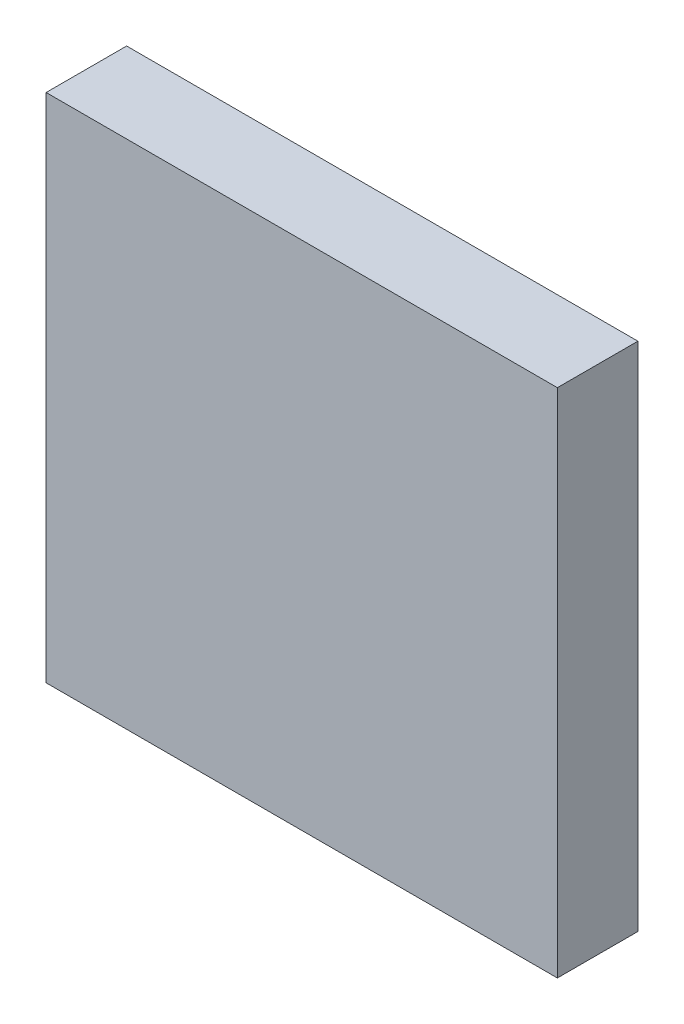
ISO-10303-21;
HEADER;
FILE_DESCRIPTION(('STEP AP214'),'2;1');
FILE_NAME('part.step','',(''),(''),'','','');
FILE_SCHEMA(('AUTOMOTIVE_DESIGN { 1 0 10303 214 1 1 1 1 }'));
ENDSEC;
DATA;
#1=APPLICATION_CONTEXT('core data for automotive mechanical design processes');
#2=APPLICATION_PROTOCOL_DEFINITION('international standard','automotive_design',2000,#1);
#3=PRODUCT_CONTEXT('',#1,'mechanical');
#4=PRODUCT('Part','Part','',(#3));
#5=PRODUCT_RELATED_PRODUCT_CATEGORY('part','',(#4));
#6=PRODUCT_DEFINITION_FORMATION('','',#4);
#7=PRODUCT_DEFINITION_CONTEXT('part definition',#1,'design');
#8=PRODUCT_DEFINITION('design','',#6,#7);
#9=PRODUCT_DEFINITION_SHAPE('','',#8);
#10=(LENGTH_UNIT() NAMED_UNIT(*) SI_UNIT(.MILLI.,.METRE.));
#11=(NAMED_UNIT(*) PLANE_ANGLE_UNIT() SI_UNIT($,.RADIAN.));
#12=(NAMED_UNIT(*) SI_UNIT($,.STERADIAN.) SOLID_ANGLE_UNIT());
#13=UNCERTAINTY_MEASURE_WITH_UNIT(LENGTH_MEASURE(1.E-05),#10,'distance_accuracy_value','');
#14=(GEOMETRIC_REPRESENTATION_CONTEXT(3) GLOBAL_UNCERTAINTY_ASSIGNED_CONTEXT((#13)) GLOBAL_UNIT_ASSIGNED_CONTEXT((#10,
#11,#12)) REPRESENTATION_CONTEXT('',''));
#15=CARTESIAN_POINT('',(0.,0.,0.));
#16=DIRECTION('',(0.,0.,1.));
#17=DIRECTION('',(1.,0.,0.));
#18=AXIS2_PLACEMENT_3D('',#15,#16,#17);
#19=CARTESIAN_POINT('',(31.75,31.75,10.));
#20=DIRECTION('',(0.,-1.,0.));
#21=DIRECTION('',(0.,0.,-1.));
#22=AXIS2_PLACEMENT_3D('',#19,#20,#21);
#23=PLANE('',#22);
#24=DIRECTION('',(-1.,0.,0.));
#25=VECTOR('',#24,1.);
#26=CARTESIAN_POINT('',(31.75,31.75,0.));
#27=LINE('',#26,#25);
#28=CARTESIAN_POINT('',(31.75,31.75,0.));
#29=VERTEX_POINT('',#28);
#30=CARTESIAN_POINT('',(-31.75,31.75,0.));
#31=VERTEX_POINT('',#30);
#32=EDGE_CURVE('E104',#29,#31,#27,.T.);
#33=ORIENTED_EDGE('',*,*,#32,.T.);
#34=DIRECTION('',(0.,0.,-1.));
#35=VECTOR('',#34,1.);
#36=CARTESIAN_POINT('',(-31.75,31.75,10.));
#37=LINE('',#36,#35);
#38=CARTESIAN_POINT('',(-31.75,31.75,10.));
#39=VERTEX_POINT('',#38);
#40=EDGE_CURVE('E11',#39,#31,#37,.T.);
#41=ORIENTED_EDGE('',*,*,#40,.F.);
#42=DIRECTION('',(-1.,0.,0.));
#43=VECTOR('',#42,1.);
#44=CARTESIAN_POINT('',(31.75,31.75,10.));
#45=LINE('',#44,#43);
#46=CARTESIAN_POINT('',(31.75,31.75,10.));
#47=VERTEX_POINT('',#46);
#48=EDGE_CURVE('E92',#47,#39,#45,.T.);
#49=ORIENTED_EDGE('',*,*,#48,.F.);
#50=DIRECTION('',(0.,0.,-1.));
#51=VECTOR('',#50,1.);
#52=CARTESIAN_POINT('',(31.75,31.75,10.));
#53=LINE('',#52,#51);
#54=EDGE_CURVE('E100',#47,#29,#53,.T.);
#55=ORIENTED_EDGE('',*,*,#54,.T.);
#56=EDGE_LOOP('',(#33,#41,#49,#55));
#57=FACE_BOUND('',#56,.T.);
#58=ADVANCED_FACE('F41',(#57),#23,.F.);
#59=CARTESIAN_POINT('',(-31.75,31.75,10.));
#60=DIRECTION('',(1.,0.,0.));
#61=DIRECTION('',(0.,0.,-1.));
#62=AXIS2_PLACEMENT_3D('',#59,#60,#61);
#63=PLANE('',#62);
#64=DIRECTION('',(0.,-1.,0.));
#65=VECTOR('',#64,1.);
#66=CARTESIAN_POINT('',(-31.75,31.75,0.));
#67=LINE('',#66,#65);
#68=CARTESIAN_POINT('',(-31.75,-31.75,0.));
#69=VERTEX_POINT('',#68);
#70=EDGE_CURVE('E96',#31,#69,#67,.T.);
#71=ORIENTED_EDGE('',*,*,#70,.T.);
#72=DIRECTION('',(0.,0.,-1.));
#73=VECTOR('',#72,1.);
#74=CARTESIAN_POINT('',(-31.75,-31.75,10.));
#75=LINE('',#74,#73);
#76=CARTESIAN_POINT('',(-31.75,-31.75,10.));
#77=VERTEX_POINT('',#76);
#78=EDGE_CURVE('E49',#77,#69,#75,.T.);
#79=ORIENTED_EDGE('',*,*,#78,.F.);
#80=DIRECTION('',(0.,-1.,0.));
#81=VECTOR('',#80,1.);
#82=CARTESIAN_POINT('',(-31.75,31.75,10.));
#83=LINE('',#82,#81);
#84=EDGE_CURVE('E87',#39,#77,#83,.T.);
#85=ORIENTED_EDGE('',*,*,#84,.F.);
#86=ORIENTED_EDGE('',*,*,#40,.T.);
#87=EDGE_LOOP('',(#71,#79,#85,#86));
#88=FACE_BOUND('',#87,.T.);
#89=ADVANCED_FACE('F95',(#88),#63,.F.);
#90=CARTESIAN_POINT('',(-31.75,-31.75,10.));
#91=DIRECTION('',(0.,1.,0.));
#92=DIRECTION('',(0.,0.,1.));
#93=AXIS2_PLACEMENT_3D('',#90,#91,#92);
#94=PLANE('',#93);
#95=DIRECTION('',(1.,0.,0.));
#96=VECTOR('',#95,1.);
#97=CARTESIAN_POINT('',(-31.75,-31.75,0.));
#98=LINE('',#97,#96);
#99=CARTESIAN_POINT('',(31.75,-31.75,0.));
#100=VERTEX_POINT('',#99);
#101=EDGE_CURVE('E74',#69,#100,#98,.T.);
#102=ORIENTED_EDGE('',*,*,#101,.T.);
#103=DIRECTION('',(0.,0.,-1.));
#104=VECTOR('',#103,1.);
#105=CARTESIAN_POINT('',(31.75,-31.75,10.));
#106=LINE('',#105,#104);
#107=CARTESIAN_POINT('',(31.75,-31.75,10.));
#108=VERTEX_POINT('',#107);
#109=EDGE_CURVE('E97',#108,#100,#106,.T.);
#110=ORIENTED_EDGE('',*,*,#109,.F.);
#111=DIRECTION('',(1.,0.,0.));
#112=VECTOR('',#111,1.);
#113=CARTESIAN_POINT('',(-31.75,-31.75,10.));
#114=LINE('',#113,#112);
#115=EDGE_CURVE('E90',#77,#108,#114,.T.);
#116=ORIENTED_EDGE('',*,*,#115,.F.);
#117=ORIENTED_EDGE('',*,*,#78,.T.);
#118=EDGE_LOOP('',(#102,#110,#116,#117));
#119=FACE_BOUND('',#118,.T.);
#120=ADVANCED_FACE('F98',(#119),#94,.F.);
#121=CARTESIAN_POINT('',(31.75,-31.75,10.));
#122=DIRECTION('',(-1.,0.,0.));
#123=DIRECTION('',(0.,-1.,0.));
#124=AXIS2_PLACEMENT_3D('',#121,#122,#123);
#125=PLANE('',#124);
#126=DIRECTION('',(0.,1.,0.));
#127=VECTOR('',#126,1.);
#128=CARTESIAN_POINT('',(31.75,-31.75,0.));
#129=LINE('',#128,#127);
#130=EDGE_CURVE('E80',#100,#29,#129,.T.);
#131=ORIENTED_EDGE('',*,*,#130,.T.);
#132=ORIENTED_EDGE('',*,*,#54,.F.);
#133=DIRECTION('',(0.,1.,0.));
#134=VECTOR('',#133,1.);
#135=CARTESIAN_POINT('',(31.75,-31.75,10.));
#136=LINE('',#135,#134);
#137=EDGE_CURVE('E57',#108,#47,#136,.T.);
#138=ORIENTED_EDGE('',*,*,#137,.F.);
#139=ORIENTED_EDGE('',*,*,#109,.T.);
#140=EDGE_LOOP('',(#131,#132,#138,#139));
#141=FACE_BOUND('',#140,.T.);
#142=ADVANCED_FACE('F111',(#141),#125,.F.);
#143=CARTESIAN_POINT('',(0.,0.,10.));
#144=DIRECTION('',(0.,0.,1.));
#145=DIRECTION('',(1.,0.,0.));
#146=AXIS2_PLACEMENT_3D('',#143,#144,#145);
#147=PLANE('',#146);
#148=ORIENTED_EDGE('',*,*,#48,.T.);
#149=ORIENTED_EDGE('',*,*,#84,.T.);
#150=ORIENTED_EDGE('',*,*,#115,.T.);
#151=ORIENTED_EDGE('',*,*,#137,.T.);
#152=EDGE_LOOP('',(#148,#149,#150,#151));
#153=FACE_BOUND('',#152,.T.);
#154=ADVANCED_FACE('F88',(#153),#147,.T.);
#155=CARTESIAN_POINT('',(0.,0.,0.));
#156=DIRECTION('',(0.,0.,1.));
#157=DIRECTION('',(1.,0.,0.));
#158=AXIS2_PLACEMENT_3D('',#155,#156,#157);
#159=PLANE('',#158);
#160=ORIENTED_EDGE('',*,*,#32,.F.);
#161=ORIENTED_EDGE('',*,*,#130,.F.);
#162=ORIENTED_EDGE('',*,*,#101,.F.);
#163=ORIENTED_EDGE('',*,*,#70,.F.);
#164=EDGE_LOOP('',(#160,#161,#162,#163));
#165=FACE_BOUND('',#164,.T.);
#166=ADVANCED_FACE('F114',(#165),#159,.F.);
#167=CLOSED_SHELL('',(#58,#89,#120,#142,#154,#166));
#168=MANIFOLD_SOLID_BREP('B2',#167);
#169=ADVANCED_BREP_SHAPE_REPRESENTATION('',(#18,#168),#14);
#170=SHAPE_DEFINITION_REPRESENTATION(#9,#169);
ENDSEC;
END-ISO-10303-21;
